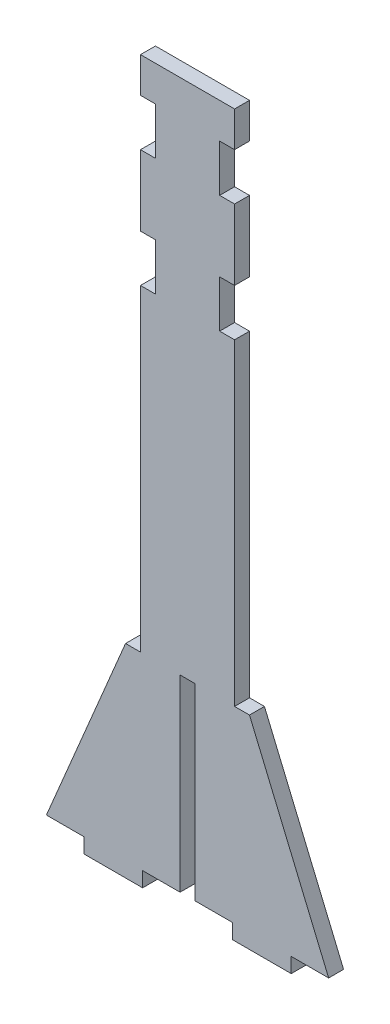
ISO-10303-21;
HEADER;
FILE_DESCRIPTION(('STEP AP214'),'2;1');
FILE_NAME('part.step','',(''),(''),'','','');
FILE_SCHEMA(('AUTOMOTIVE_DESIGN { 1 0 10303 214 1 1 1 1 }'));
ENDSEC;
DATA;
#1=APPLICATION_CONTEXT('core data for automotive mechanical design processes');
#2=APPLICATION_PROTOCOL_DEFINITION('international standard','automotive_design',2000,#1);
#3=PRODUCT_CONTEXT('',#1,'mechanical');
#4=PRODUCT('Part','Part','',(#3));
#5=PRODUCT_RELATED_PRODUCT_CATEGORY('part','',(#4));
#6=PRODUCT_DEFINITION_FORMATION('','',#4);
#7=PRODUCT_DEFINITION_CONTEXT('part definition',#1,'design');
#8=PRODUCT_DEFINITION('design','',#6,#7);
#9=PRODUCT_DEFINITION_SHAPE('','',#8);
#10=(LENGTH_UNIT() NAMED_UNIT(*) SI_UNIT(.MILLI.,.METRE.));
#11=(NAMED_UNIT(*) PLANE_ANGLE_UNIT() SI_UNIT($,.RADIAN.));
#12=(NAMED_UNIT(*) SI_UNIT($,.STERADIAN.) SOLID_ANGLE_UNIT());
#13=UNCERTAINTY_MEASURE_WITH_UNIT(LENGTH_MEASURE(1.E-05),#10,'distance_accuracy_value','');
#14=(GEOMETRIC_REPRESENTATION_CONTEXT(3) GLOBAL_UNCERTAINTY_ASSIGNED_CONTEXT((#13)) GLOBAL_UNIT_ASSIGNED_CONTEXT((#10,
#11,#12)) REPRESENTATION_CONTEXT('',''));
#15=CARTESIAN_POINT('',(0.,0.,0.));
#16=DIRECTION('',(0.,0.,1.));
#17=DIRECTION('',(1.,0.,0.));
#18=AXIS2_PLACEMENT_3D('',#15,#16,#17);
#19=CARTESIAN_POINT('',(-60.,0.,6.35));
#20=DIRECTION('',(0.,1.,0.));
#21=DIRECTION('',(-1.,0.,0.));
#22=AXIS2_PLACEMENT_3D('',#19,#20,#21);
#23=PLANE('',#22);
#24=DIRECTION('',(0.,0.,-1.));
#25=VECTOR('',#24,1.);
#26=CARTESIAN_POINT('',(19.0875,0.,6.35));
#27=LINE('',#26,#25);
#28=CARTESIAN_POINT('',(19.0875,0.,6.35));
#29=VERTEX_POINT('',#28);
#30=CARTESIAN_POINT('',(19.0875,0.,0.));
#31=VERTEX_POINT('',#30);
#32=EDGE_CURVE('E60',#29,#31,#27,.T.);
#33=ORIENTED_EDGE('',*,*,#32,.F.);
#34=DIRECTION('',(1.,0.,0.));
#35=VECTOR('',#34,1.);
#36=CARTESIAN_POINT('',(-60.,0.,6.35));
#37=LINE('',#36,#35);
#38=CARTESIAN_POINT('',(3.17500000000005,0.,6.35));
#39=VERTEX_POINT('',#38);
#40=EDGE_CURVE('E296',#39,#29,#37,.T.);
#41=ORIENTED_EDGE('',*,*,#40,.F.);
#42=DIRECTION('',(0.,0.,1.));
#43=VECTOR('',#42,1.);
#44=CARTESIAN_POINT('',(3.17500000000005,0.,-0.00100000000000013));
#45=LINE('',#44,#43);
#46=CARTESIAN_POINT('',(3.17500000000005,0.,0.));
#47=VERTEX_POINT('',#46);
#48=EDGE_CURVE('E457',#47,#39,#45,.T.);
#49=ORIENTED_EDGE('',*,*,#48,.F.);
#50=DIRECTION('',(1.,0.,0.));
#51=VECTOR('',#50,1.);
#52=CARTESIAN_POINT('',(-60.,0.,0.));
#53=LINE('',#52,#51);
#54=EDGE_CURVE('E499',#47,#31,#53,.T.);
#55=ORIENTED_EDGE('',*,*,#54,.T.);
#56=EDGE_LOOP('',(#33,#41,#49,#55));
#57=FACE_BOUND('',#56,.T.);
#58=ADVANCED_FACE('F37',(#57),#23,.F.);
#59=DIRECTION('',(0.,0.,1.));
#60=VECTOR('',#59,1.);
#61=CARTESIAN_POINT('',(44.0875,0.,6.34999999999999));
#62=LINE('',#61,#60);
#63=CARTESIAN_POINT('',(44.0875,0.,0.));
#64=VERTEX_POINT('',#63);
#65=CARTESIAN_POINT('',(44.0875,0.,6.35));
#66=VERTEX_POINT('',#65);
#67=EDGE_CURVE('E291',#64,#66,#62,.T.);
#68=ORIENTED_EDGE('',*,*,#67,.F.);
#69=CARTESIAN_POINT('',(60.,0.,0.));
#70=VERTEX_POINT('',#69);
#71=EDGE_CURVE('E494',#64,#70,#53,.T.);
#72=ORIENTED_EDGE('',*,*,#71,.T.);
#73=DIRECTION('',(0.,0.,-1.));
#74=VECTOR('',#73,1.);
#75=CARTESIAN_POINT('',(60.,0.,6.35));
#76=LINE('',#75,#74);
#77=CARTESIAN_POINT('',(60.,0.,6.35));
#78=VERTEX_POINT('',#77);
#79=EDGE_CURVE('E521',#78,#70,#76,.T.);
#80=ORIENTED_EDGE('',*,*,#79,.F.);
#81=EDGE_CURVE('E52',#66,#78,#37,.T.);
#82=ORIENTED_EDGE('',*,*,#81,.F.);
#83=EDGE_LOOP('',(#68,#72,#80,#82));
#84=FACE_BOUND('',#83,.T.);
#85=ADVANCED_FACE('F625',(#84),#23,.F.);
#86=DIRECTION('',(0.,0.,1.));
#87=VECTOR('',#86,1.);
#88=CARTESIAN_POINT('',(-19.0875,0.,6.35));
#89=LINE('',#88,#87);
#90=CARTESIAN_POINT('',(-19.0875,0.,0.));
#91=VERTEX_POINT('',#90);
#92=CARTESIAN_POINT('',(-19.0875,0.,6.35));
#93=VERTEX_POINT('',#92);
#94=EDGE_CURVE('E297',#91,#93,#89,.T.);
#95=ORIENTED_EDGE('',*,*,#94,.F.);
#96=CARTESIAN_POINT('',(-3.17499999999996,0.,0.));
#97=VERTEX_POINT('',#96);
#98=EDGE_CURVE('E498',#91,#97,#53,.T.);
#99=ORIENTED_EDGE('',*,*,#98,.T.);
#100=DIRECTION('',(0.,0.,1.));
#101=VECTOR('',#100,1.);
#102=CARTESIAN_POINT('',(-3.17499999999995,0.,-0.00100000000000013));
#103=LINE('',#102,#101);
#104=CARTESIAN_POINT('',(-3.17499999999995,0.,6.35));
#105=VERTEX_POINT('',#104);
#106=EDGE_CURVE('E451',#97,#105,#103,.T.);
#107=ORIENTED_EDGE('',*,*,#106,.T.);
#108=EDGE_CURVE('E474',#93,#105,#37,.T.);
#109=ORIENTED_EDGE('',*,*,#108,.F.);
#110=EDGE_LOOP('',(#95,#99,#107,#109));
#111=FACE_BOUND('',#110,.T.);
#112=ADVANCED_FACE('F631',(#111),#23,.F.);
#113=DIRECTION('',(0.,0.,-1.));
#114=VECTOR('',#113,1.);
#115=CARTESIAN_POINT('',(-44.0875,0.,6.34999999999999));
#116=LINE('',#115,#114);
#117=CARTESIAN_POINT('',(-44.0875,0.,6.35));
#118=VERTEX_POINT('',#117);
#119=CARTESIAN_POINT('',(-44.0875,0.,0.));
#120=VERTEX_POINT('',#119);
#121=EDGE_CURVE('E300',#118,#120,#116,.T.);
#122=ORIENTED_EDGE('',*,*,#121,.F.);
#123=CARTESIAN_POINT('',(-60.,0.,6.35));
#124=VERTEX_POINT('',#123);
#125=EDGE_CURVE('E470',#124,#118,#37,.T.);
#126=ORIENTED_EDGE('',*,*,#125,.F.);
#127=DIRECTION('',(0.,0.,-1.));
#128=VECTOR('',#127,1.);
#129=CARTESIAN_POINT('',(-60.,0.,6.35));
#130=LINE('',#129,#128);
#131=CARTESIAN_POINT('',(-60.,0.,0.));
#132=VERTEX_POINT('',#131);
#133=EDGE_CURVE('E524',#124,#132,#130,.T.);
#134=ORIENTED_EDGE('',*,*,#133,.T.);
#135=EDGE_CURVE('E495',#132,#120,#53,.T.);
#136=ORIENTED_EDGE('',*,*,#135,.T.);
#137=EDGE_LOOP('',(#122,#126,#134,#136));
#138=FACE_BOUND('',#137,.T.);
#139=ADVANCED_FACE('F543',(#138),#23,.F.);
#140=CARTESIAN_POINT('',(-20.,300.,6.35));
#141=DIRECTION('',(1.,0.,0.));
#142=DIRECTION('',(0.,1.,0.));
#143=AXIS2_PLACEMENT_3D('',#140,#141,#142);
#144=PLANE('',#143);
#145=DIRECTION('',(0.,-1.,0.));
#146=VECTOR('',#145,1.);
#147=CARTESIAN_POINT('',(-20.,300.,0.));
#148=LINE('',#147,#146);
#149=CARTESIAN_POINT('',(-20.,300.,0.));
#150=VERTEX_POINT('',#149);
#151=CARTESIAN_POINT('',(-20.,285.,0.));
#152=VERTEX_POINT('',#151);
#153=EDGE_CURVE('E486',#150,#152,#148,.T.);
#154=ORIENTED_EDGE('',*,*,#153,.T.);
#155=DIRECTION('',(0.,0.,1.));
#156=VECTOR('',#155,1.);
#157=CARTESIAN_POINT('',(-20.,285.,-0.00100000000000013));
#158=LINE('',#157,#156);
#159=CARTESIAN_POINT('',(-20.,285.,6.35));
#160=VERTEX_POINT('',#159);
#161=EDGE_CURVE('E374',#152,#160,#158,.T.);
#162=ORIENTED_EDGE('',*,*,#161,.T.);
#163=DIRECTION('',(0.,-1.,0.));
#164=VECTOR('',#163,1.);
#165=CARTESIAN_POINT('',(-20.,300.,6.35));
#166=LINE('',#165,#164);
#167=CARTESIAN_POINT('',(-20.,300.,6.35));
#168=VERTEX_POINT('',#167);
#169=EDGE_CURVE('E461',#168,#160,#166,.T.);
#170=ORIENTED_EDGE('',*,*,#169,.F.);
#171=DIRECTION('',(0.,0.,-1.));
#172=VECTOR('',#171,1.);
#173=CARTESIAN_POINT('',(-20.,300.,6.35));
#174=LINE('',#173,#172);
#175=EDGE_CURVE('E485',#168,#150,#174,.T.);
#176=ORIENTED_EDGE('',*,*,#175,.T.);
#177=EDGE_LOOP('',(#154,#162,#170,#176));
#178=FACE_BOUND('',#177,.T.);
#179=ADVANCED_FACE('F583',(#178),#144,.F.);
#180=CARTESIAN_POINT('',(-20.,265.,6.35));
#181=VERTEX_POINT('',#180);
#182=CARTESIAN_POINT('',(-20.,235.,6.35));
#183=VERTEX_POINT('',#182);
#184=EDGE_CURVE('E465',#181,#183,#166,.T.);
#185=ORIENTED_EDGE('',*,*,#184,.F.);
#186=DIRECTION('',(0.,0.,1.));
#187=VECTOR('',#186,1.);
#188=CARTESIAN_POINT('',(-20.,265.,-0.00100000000000013));
#189=LINE('',#188,#187);
#190=CARTESIAN_POINT('',(-20.,265.,0.));
#191=VERTEX_POINT('',#190);
#192=EDGE_CURVE('E373',#191,#181,#189,.T.);
#193=ORIENTED_EDGE('',*,*,#192,.F.);
#194=CARTESIAN_POINT('',(-20.,235.,0.));
#195=VERTEX_POINT('',#194);
#196=EDGE_CURVE('E490',#191,#195,#148,.T.);
#197=ORIENTED_EDGE('',*,*,#196,.T.);
#198=DIRECTION('',(0.,0.,1.));
#199=VECTOR('',#198,1.);
#200=CARTESIAN_POINT('',(-20.,235.,-0.00100000000000013));
#201=LINE('',#200,#199);
#202=EDGE_CURVE('E346',#195,#183,#201,.T.);
#203=ORIENTED_EDGE('',*,*,#202,.T.);
#204=EDGE_LOOP('',(#185,#193,#197,#203));
#205=FACE_BOUND('',#204,.T.);
#206=ADVANCED_FACE('F560',(#205),#144,.F.);
#207=CARTESIAN_POINT('',(20.,300.,6.35));
#208=DIRECTION('',(-1.,0.,0.));
#209=DIRECTION('',(0.,-1.,0.));
#210=AXIS2_PLACEMENT_3D('',#207,#208,#209);
#211=PLANE('',#210);
#212=DIRECTION('',(0.,1.,0.));
#213=VECTOR('',#212,1.);
#214=CARTESIAN_POINT('',(20.,300.,6.35));
#215=LINE('',#214,#213);
#216=CARTESIAN_POINT('',(20.,285.,6.35));
#217=VERTEX_POINT('',#216);
#218=CARTESIAN_POINT('',(20.,300.,6.35));
#219=VERTEX_POINT('',#218);
#220=EDGE_CURVE('E478',#217,#219,#215,.T.);
#221=ORIENTED_EDGE('',*,*,#220,.F.);
#222=DIRECTION('',(0.,0.,1.));
#223=VECTOR('',#222,1.);
#224=CARTESIAN_POINT('',(20.,285.,-0.00100000000000013));
#225=LINE('',#224,#223);
#226=CARTESIAN_POINT('',(20.,285.,0.));
#227=VERTEX_POINT('',#226);
#228=EDGE_CURVE('E400',#227,#217,#225,.T.);
#229=ORIENTED_EDGE('',*,*,#228,.F.);
#230=DIRECTION('',(0.,1.,0.));
#231=VECTOR('',#230,1.);
#232=CARTESIAN_POINT('',(20.,300.,0.));
#233=LINE('',#232,#231);
#234=CARTESIAN_POINT('',(20.,300.,0.));
#235=VERTEX_POINT('',#234);
#236=EDGE_CURVE('E503',#227,#235,#233,.T.);
#237=ORIENTED_EDGE('',*,*,#236,.T.);
#238=DIRECTION('',(0.,0.,-1.));
#239=VECTOR('',#238,1.);
#240=CARTESIAN_POINT('',(20.,300.,6.35));
#241=LINE('',#240,#239);
#242=EDGE_CURVE('E512',#219,#235,#241,.T.);
#243=ORIENTED_EDGE('',*,*,#242,.F.);
#244=EDGE_LOOP('',(#221,#229,#237,#243));
#245=FACE_BOUND('',#244,.T.);
#246=ADVANCED_FACE('F611',(#245),#211,.F.);
#247=CARTESIAN_POINT('',(20.,235.,0.));
#248=VERTEX_POINT('',#247);
#249=CARTESIAN_POINT('',(20.,265.,0.));
#250=VERTEX_POINT('',#249);
#251=EDGE_CURVE('E508',#248,#250,#233,.T.);
#252=ORIENTED_EDGE('',*,*,#251,.T.);
#253=DIRECTION('',(0.,0.,1.));
#254=VECTOR('',#253,1.);
#255=CARTESIAN_POINT('',(20.,265.,-0.00100000000000013));
#256=LINE('',#255,#254);
#257=CARTESIAN_POINT('',(20.,265.,6.35));
#258=VERTEX_POINT('',#257);
#259=EDGE_CURVE('E402',#250,#258,#256,.T.);
#260=ORIENTED_EDGE('',*,*,#259,.T.);
#261=CARTESIAN_POINT('',(20.,235.,6.35));
#262=VERTEX_POINT('',#261);
#263=EDGE_CURVE('E483',#262,#258,#215,.T.);
#264=ORIENTED_EDGE('',*,*,#263,.F.);
#265=DIRECTION('',(0.,0.,1.));
#266=VECTOR('',#265,1.);
#267=CARTESIAN_POINT('',(20.,235.,-0.00100000000000013));
#268=LINE('',#267,#266);
#269=EDGE_CURVE('E425',#248,#262,#268,.T.);
#270=ORIENTED_EDGE('',*,*,#269,.F.);
#271=EDGE_LOOP('',(#252,#260,#264,#270));
#272=FACE_BOUND('',#271,.T.);
#273=ADVANCED_FACE('F597',(#272),#211,.F.);
#274=CARTESIAN_POINT('',(-20.,215.,6.35));
#275=VERTEX_POINT('',#274);
#276=CARTESIAN_POINT('',(-20.,80.,6.35));
#277=VERTEX_POINT('',#276);
#278=EDGE_CURVE('E466',#275,#277,#166,.T.);
#279=ORIENTED_EDGE('',*,*,#278,.F.);
#280=DIRECTION('',(0.,0.,1.));
#281=VECTOR('',#280,1.);
#282=CARTESIAN_POINT('',(-20.,215.,-0.00100000000000013));
#283=LINE('',#282,#281);
#284=CARTESIAN_POINT('',(-20.,215.,0.));
#285=VERTEX_POINT('',#284);
#286=EDGE_CURVE('E345',#285,#275,#283,.T.);
#287=ORIENTED_EDGE('',*,*,#286,.F.);
#288=CARTESIAN_POINT('',(-20.,80.,0.));
#289=VERTEX_POINT('',#288);
#290=EDGE_CURVE('E454',#285,#289,#148,.T.);
#291=ORIENTED_EDGE('',*,*,#290,.T.);
#292=DIRECTION('',(0.,0.,-1.));
#293=VECTOR('',#292,1.);
#294=CARTESIAN_POINT('',(-20.,80.,6.35));
#295=LINE('',#294,#293);
#296=EDGE_CURVE('E11',#277,#289,#295,.T.);
#297=ORIENTED_EDGE('',*,*,#296,.F.);
#298=EDGE_LOOP('',(#279,#287,#291,#297));
#299=FACE_BOUND('',#298,.T.);
#300=ADVANCED_FACE('F39',(#299),#144,.F.);
#301=CARTESIAN_POINT('',(-20.,80.,6.35));
#302=DIRECTION('',(0.,-1.,0.));
#303=DIRECTION('',(1.,0.,0.));
#304=AXIS2_PLACEMENT_3D('',#301,#302,#303);
#305=PLANE('',#304);
#306=DIRECTION('',(-1.,0.,0.));
#307=VECTOR('',#306,1.);
#308=CARTESIAN_POINT('',(-20.,80.,0.));
#309=LINE('',#308,#307);
#310=CARTESIAN_POINT('',(-26.35,80.,0.));
#311=VERTEX_POINT('',#310);
#312=EDGE_CURVE('E489',#289,#311,#309,.T.);
#313=ORIENTED_EDGE('',*,*,#312,.T.);
#314=DIRECTION('',(0.,0.,-1.));
#315=VECTOR('',#314,1.);
#316=CARTESIAN_POINT('',(-26.35,80.,6.35));
#317=LINE('',#316,#315);
#318=CARTESIAN_POINT('',(-26.35,80.,6.35));
#319=VERTEX_POINT('',#318);
#320=EDGE_CURVE('E45',#319,#311,#317,.T.);
#321=ORIENTED_EDGE('',*,*,#320,.F.);
#322=DIRECTION('',(-1.,0.,0.));
#323=VECTOR('',#322,1.);
#324=CARTESIAN_POINT('',(-20.,80.,6.35));
#325=LINE('',#324,#323);
#326=EDGE_CURVE('E464',#277,#319,#325,.T.);
#327=ORIENTED_EDGE('',*,*,#326,.F.);
#328=ORIENTED_EDGE('',*,*,#296,.T.);
#329=EDGE_LOOP('',(#313,#321,#327,#328));
#330=FACE_BOUND('',#329,.T.);
#331=ADVANCED_FACE('F552',(#330),#305,.F.);
#332=CARTESIAN_POINT('',(-26.35,80.,6.35));
#333=DIRECTION('',(0.921776291869761,-0.387722152767718,0.));
#334=DIRECTION('',(0.387722152767718,0.921776291869761,0.));
#335=AXIS2_PLACEMENT_3D('',#332,#333,#334);
#336=PLANE('',#335);
#337=DIRECTION('',(-0.387722152767718,-0.921776291869761,0.));
#338=VECTOR('',#337,1.);
#339=CARTESIAN_POINT('',(-26.35,80.,0.));
#340=LINE('',#339,#338);
#341=EDGE_CURVE('E492',#311,#132,#340,.T.);
#342=ORIENTED_EDGE('',*,*,#341,.T.);
#343=ORIENTED_EDGE('',*,*,#133,.F.);
#344=DIRECTION('',(-0.387722152767718,-0.921776291869761,0.));
#345=VECTOR('',#344,1.);
#346=CARTESIAN_POINT('',(-26.35,80.,6.35));
#347=LINE('',#346,#345);
#348=EDGE_CURVE('E468',#319,#124,#347,.T.);
#349=ORIENTED_EDGE('',*,*,#348,.F.);
#350=ORIENTED_EDGE('',*,*,#320,.T.);
#351=EDGE_LOOP('',(#342,#343,#349,#350));
#352=FACE_BOUND('',#351,.T.);
#353=ADVANCED_FACE('F531',(#352),#336,.F.);
#354=CARTESIAN_POINT('',(26.3499999999999,80.,6.35));
#355=DIRECTION('',(-0.92177629186976,-0.387722152767719,0.));
#356=DIRECTION('',(0.387722152767719,-0.92177629186976,0.));
#357=AXIS2_PLACEMENT_3D('',#354,#355,#356);
#358=PLANE('',#357);
#359=DIRECTION('',(-0.387722152767719,0.92177629186976,0.));
#360=VECTOR('',#359,1.);
#361=CARTESIAN_POINT('',(26.3499999999999,80.,0.));
#362=LINE('',#361,#360);
#363=CARTESIAN_POINT('',(26.3499999999999,80.,0.));
#364=VERTEX_POINT('',#363);
#365=EDGE_CURVE('E497',#70,#364,#362,.T.);
#366=ORIENTED_EDGE('',*,*,#365,.T.);
#367=DIRECTION('',(0.,0.,-1.));
#368=VECTOR('',#367,1.);
#369=CARTESIAN_POINT('',(26.3499999999999,80.,6.35));
#370=LINE('',#369,#368);
#371=CARTESIAN_POINT('',(26.3499999999999,80.,6.35));
#372=VERTEX_POINT('',#371);
#373=EDGE_CURVE('E518',#372,#364,#370,.T.);
#374=ORIENTED_EDGE('',*,*,#373,.F.);
#375=DIRECTION('',(-0.387722152767719,0.92177629186976,0.));
#376=VECTOR('',#375,1.);
#377=CARTESIAN_POINT('',(26.3499999999999,80.,6.35));
#378=LINE('',#377,#376);
#379=EDGE_CURVE('E473',#78,#372,#378,.T.);
#380=ORIENTED_EDGE('',*,*,#379,.F.);
#381=ORIENTED_EDGE('',*,*,#79,.T.);
#382=EDGE_LOOP('',(#366,#374,#380,#381));
#383=FACE_BOUND('',#382,.T.);
#384=ADVANCED_FACE('F655',(#383),#358,.F.);
#385=CARTESIAN_POINT('',(26.3499999999999,80.,6.35));
#386=DIRECTION('',(0.,-1.,0.));
#387=DIRECTION('',(1.,0.,0.));
#388=AXIS2_PLACEMENT_3D('',#385,#386,#387);
#389=PLANE('',#388);
#390=DIRECTION('',(-1.,0.,0.));
#391=VECTOR('',#390,1.);
#392=CARTESIAN_POINT('',(26.3499999999999,80.,0.));
#393=LINE('',#392,#391);
#394=CARTESIAN_POINT('',(19.9999999999999,80.,0.));
#395=VERTEX_POINT('',#394);
#396=EDGE_CURVE('E501',#364,#395,#393,.T.);
#397=ORIENTED_EDGE('',*,*,#396,.T.);
#398=DIRECTION('',(0.,0.,-1.));
#399=VECTOR('',#398,1.);
#400=CARTESIAN_POINT('',(19.9999999999999,80.,6.35));
#401=LINE('',#400,#399);
#402=CARTESIAN_POINT('',(19.9999999999999,80.,6.35));
#403=VERTEX_POINT('',#402);
#404=EDGE_CURVE('E515',#403,#395,#401,.T.);
#405=ORIENTED_EDGE('',*,*,#404,.F.);
#406=DIRECTION('',(-1.,0.,0.));
#407=VECTOR('',#406,1.);
#408=CARTESIAN_POINT('',(26.3499999999999,80.,6.35));
#409=LINE('',#408,#407);
#410=EDGE_CURVE('E476',#372,#403,#409,.T.);
#411=ORIENTED_EDGE('',*,*,#410,.F.);
#412=ORIENTED_EDGE('',*,*,#373,.T.);
#413=EDGE_LOOP('',(#397,#405,#411,#412));
#414=FACE_BOUND('',#413,.T.);
#415=ADVANCED_FACE('F622',(#414),#389,.F.);
#416=CARTESIAN_POINT('',(20.,215.,0.));
#417=VERTEX_POINT('',#416);
#418=EDGE_CURVE('E504',#395,#417,#233,.T.);
#419=ORIENTED_EDGE('',*,*,#418,.T.);
#420=DIRECTION('',(0.,0.,1.));
#421=VECTOR('',#420,1.);
#422=CARTESIAN_POINT('',(20.,215.,-0.00100000000000013));
#423=LINE('',#422,#421);
#424=CARTESIAN_POINT('',(20.,215.,6.35));
#425=VERTEX_POINT('',#424);
#426=EDGE_CURVE('E427',#417,#425,#423,.T.);
#427=ORIENTED_EDGE('',*,*,#426,.T.);
#428=EDGE_CURVE('E479',#403,#425,#215,.T.);
#429=ORIENTED_EDGE('',*,*,#428,.F.);
#430=ORIENTED_EDGE('',*,*,#404,.T.);
#431=EDGE_LOOP('',(#419,#427,#429,#430));
#432=FACE_BOUND('',#431,.T.);
#433=ADVANCED_FACE('F614',(#432),#211,.F.);
#434=CARTESIAN_POINT('',(-20.,300.,6.35));
#435=DIRECTION('',(0.,-1.,0.));
#436=DIRECTION('',(0.,0.,-1.));
#437=AXIS2_PLACEMENT_3D('',#434,#435,#436);
#438=PLANE('',#437);
#439=DIRECTION('',(-1.,0.,0.));
#440=VECTOR('',#439,1.);
#441=CARTESIAN_POINT('',(-20.,300.,0.));
#442=LINE('',#441,#440);
#443=EDGE_CURVE('E507',#235,#150,#442,.T.);
#444=ORIENTED_EDGE('',*,*,#443,.T.);
#445=ORIENTED_EDGE('',*,*,#175,.F.);
#446=DIRECTION('',(-1.,0.,0.));
#447=VECTOR('',#446,1.);
#448=CARTESIAN_POINT('',(-20.,300.,6.35));
#449=LINE('',#448,#447);
#450=EDGE_CURVE('E482',#219,#168,#449,.T.);
#451=ORIENTED_EDGE('',*,*,#450,.F.);
#452=ORIENTED_EDGE('',*,*,#242,.T.);
#453=EDGE_LOOP('',(#444,#445,#451,#452));
#454=FACE_BOUND('',#453,.T.);
#455=ADVANCED_FACE('F588',(#454),#438,.F.);
#456=CARTESIAN_POINT('',(0.,0.,6.35));
#457=DIRECTION('',(0.,0.,-1.));
#458=DIRECTION('',(-1.,0.,0.));
#459=AXIS2_PLACEMENT_3D('',#456,#457,#458);
#460=PLANE('',#459);
#461=DIRECTION('',(0.,-1.,0.));
#462=VECTOR('',#461,1.);
#463=CARTESIAN_POINT('',(13.65,265.,6.35));
#464=LINE('',#463,#462);
#465=CARTESIAN_POINT('',(13.65,285.,6.35));
#466=VERTEX_POINT('',#465);
#467=CARTESIAN_POINT('',(13.65,265.,6.35));
#468=VERTEX_POINT('',#467);
#469=EDGE_CURVE('E389',#466,#468,#464,.T.);
#470=ORIENTED_EDGE('',*,*,#469,.F.);
#471=DIRECTION('',(-1.,0.,0.));
#472=VECTOR('',#471,1.);
#473=CARTESIAN_POINT('',(13.65,285.,6.35));
#474=LINE('',#473,#472);
#475=EDGE_CURVE('E394',#217,#466,#474,.T.);
#476=ORIENTED_EDGE('',*,*,#475,.F.);
#477=ORIENTED_EDGE('',*,*,#220,.T.);
#478=ORIENTED_EDGE('',*,*,#450,.T.);
#479=ORIENTED_EDGE('',*,*,#169,.T.);
#480=DIRECTION('',(-1.,0.,0.));
#481=VECTOR('',#480,1.);
#482=CARTESIAN_POINT('',(-20.,285.,6.35));
#483=LINE('',#482,#481);
#484=CARTESIAN_POINT('',(-13.65,285.,6.35));
#485=VERTEX_POINT('',#484);
#486=EDGE_CURVE('E371',#485,#160,#483,.T.);
#487=ORIENTED_EDGE('',*,*,#486,.F.);
#488=DIRECTION('',(0.,1.,0.));
#489=VECTOR('',#488,1.);
#490=CARTESIAN_POINT('',(-13.65,265.,6.35));
#491=LINE('',#490,#489);
#492=CARTESIAN_POINT('',(-13.65,265.,6.35));
#493=VERTEX_POINT('',#492);
#494=EDGE_CURVE('E368',#493,#485,#491,.T.);
#495=ORIENTED_EDGE('',*,*,#494,.F.);
#496=DIRECTION('',(1.,0.,0.));
#497=VECTOR('',#496,1.);
#498=CARTESIAN_POINT('',(-20.,265.,6.35));
#499=LINE('',#498,#497);
#500=EDGE_CURVE('E365',#181,#493,#499,.T.);
#501=ORIENTED_EDGE('',*,*,#500,.F.);
#502=ORIENTED_EDGE('',*,*,#184,.T.);
#503=DIRECTION('',(-1.,0.,0.));
#504=VECTOR('',#503,1.);
#505=CARTESIAN_POINT('',(-20.,235.,6.35));
#506=LINE('',#505,#504);
#507=CARTESIAN_POINT('',(-13.65,235.,6.35));
#508=VERTEX_POINT('',#507);
#509=EDGE_CURVE('E343',#508,#183,#506,.T.);
#510=ORIENTED_EDGE('',*,*,#509,.F.);
#511=DIRECTION('',(0.,1.,0.));
#512=VECTOR('',#511,1.);
#513=CARTESIAN_POINT('',(-13.65,215.,6.35));
#514=LINE('',#513,#512);
#515=CARTESIAN_POINT('',(-13.65,215.,6.35));
#516=VERTEX_POINT('',#515);
#517=EDGE_CURVE('E340',#516,#508,#514,.T.);
#518=ORIENTED_EDGE('',*,*,#517,.F.);
#519=DIRECTION('',(1.,0.,0.));
#520=VECTOR('',#519,1.);
#521=CARTESIAN_POINT('',(-20.,215.,6.35));
#522=LINE('',#521,#520);
#523=EDGE_CURVE('E337',#275,#516,#522,.T.);
#524=ORIENTED_EDGE('',*,*,#523,.F.);
#525=ORIENTED_EDGE('',*,*,#278,.T.);
#526=ORIENTED_EDGE('',*,*,#326,.T.);
#527=ORIENTED_EDGE('',*,*,#348,.T.);
#528=ORIENTED_EDGE('',*,*,#125,.T.);
#529=DIRECTION('',(0.,1.,0.));
#530=VECTOR('',#529,1.);
#531=CARTESIAN_POINT('',(-44.0875,-6.35000000000001,6.34999999999999));
#532=LINE('',#531,#530);
#533=CARTESIAN_POINT('',(-44.0875,-6.35000000000001,6.34999999999999));
#534=VERTEX_POINT('',#533);
#535=EDGE_CURVE('E323',#534,#118,#532,.T.);
#536=ORIENTED_EDGE('',*,*,#535,.F.);
#537=DIRECTION('',(-1.,0.,0.));
#538=VECTOR('',#537,1.);
#539=CARTESIAN_POINT('',(-19.0875,-6.35,6.35));
#540=LINE('',#539,#538);
#541=CARTESIAN_POINT('',(-19.0875,-6.35,6.35));
#542=VERTEX_POINT('',#541);
#543=EDGE_CURVE('E309',#542,#534,#540,.T.);
#544=ORIENTED_EDGE('',*,*,#543,.F.);
#545=DIRECTION('',(0.,1.,0.));
#546=VECTOR('',#545,1.);
#547=CARTESIAN_POINT('',(-19.0875,-6.35,6.35));
#548=LINE('',#547,#546);
#549=EDGE_CURVE('E326',#542,#93,#548,.T.);
#550=ORIENTED_EDGE('',*,*,#549,.T.);
#551=ORIENTED_EDGE('',*,*,#108,.T.);
#552=DIRECTION('',(0.,-1.,0.));
#553=VECTOR('',#552,1.);
#554=CARTESIAN_POINT('',(-3.17499999999996,79.9999999999998,6.35));
#555=LINE('',#554,#553);
#556=CARTESIAN_POINT('',(-3.17499999999996,79.9999999999998,6.35));
#557=VERTEX_POINT('',#556);
#558=EDGE_CURVE('E442',#557,#105,#555,.T.);
#559=ORIENTED_EDGE('',*,*,#558,.F.);
#560=DIRECTION('',(-1.,0.,0.));
#561=VECTOR('',#560,1.);
#562=CARTESIAN_POINT('',(-3.17499999999996,79.9999999999998,6.35));
#563=LINE('',#562,#561);
#564=CARTESIAN_POINT('',(3.17500000000004,79.9999999999998,6.35));
#565=VERTEX_POINT('',#564);
#566=EDGE_CURVE('E448',#565,#557,#563,.T.);
#567=ORIENTED_EDGE('',*,*,#566,.F.);
#568=DIRECTION('',(0.,1.,0.));
#569=VECTOR('',#568,1.);
#570=CARTESIAN_POINT('',(3.17500000000004,79.9999999999998,6.35));
#571=LINE('',#570,#569);
#572=EDGE_CURVE('E445',#39,#565,#571,.T.);
#573=ORIENTED_EDGE('',*,*,#572,.F.);
#574=ORIENTED_EDGE('',*,*,#40,.T.);
#575=DIRECTION('',(0.,1.,0.));
#576=VECTOR('',#575,1.);
#577=CARTESIAN_POINT('',(19.0875,-6.35,6.35));
#578=LINE('',#577,#576);
#579=CARTESIAN_POINT('',(19.0875,-6.35,6.35));
#580=VERTEX_POINT('',#579);
#581=EDGE_CURVE('E276',#580,#29,#578,.T.);
#582=ORIENTED_EDGE('',*,*,#581,.F.);
#583=DIRECTION('',(-1.,0.,0.));
#584=VECTOR('',#583,1.);
#585=CARTESIAN_POINT('',(19.0875,-6.35,6.35));
#586=LINE('',#585,#584);
#587=CARTESIAN_POINT('',(44.0875,-6.34999999999999,6.34999999999999));
#588=VERTEX_POINT('',#587);
#589=EDGE_CURVE('E282',#588,#580,#586,.T.);
#590=ORIENTED_EDGE('',*,*,#589,.F.);
#591=DIRECTION('',(0.,1.,0.));
#592=VECTOR('',#591,1.);
#593=CARTESIAN_POINT('',(44.0875,-6.34999999999999,6.34999999999999));
#594=LINE('',#593,#592);
#595=EDGE_CURVE('E664',#588,#66,#594,.T.);
#596=ORIENTED_EDGE('',*,*,#595,.T.);
#597=ORIENTED_EDGE('',*,*,#81,.T.);
#598=ORIENTED_EDGE('',*,*,#379,.T.);
#599=ORIENTED_EDGE('',*,*,#410,.T.);
#600=ORIENTED_EDGE('',*,*,#428,.T.);
#601=DIRECTION('',(1.,0.,0.));
#602=VECTOR('',#601,1.);
#603=CARTESIAN_POINT('',(13.65,215.,6.35));
#604=LINE('',#603,#602);
#605=CARTESIAN_POINT('',(13.65,215.,6.35));
#606=VERTEX_POINT('',#605);
#607=EDGE_CURVE('E416',#606,#425,#604,.T.);
#608=ORIENTED_EDGE('',*,*,#607,.F.);
#609=DIRECTION('',(0.,-1.,0.));
#610=VECTOR('',#609,1.);
#611=CARTESIAN_POINT('',(13.65,215.,6.35));
#612=LINE('',#611,#610);
#613=CARTESIAN_POINT('',(13.65,235.,6.35));
#614=VERTEX_POINT('',#613);
#615=EDGE_CURVE('E413',#614,#606,#612,.T.);
#616=ORIENTED_EDGE('',*,*,#615,.F.);
#617=DIRECTION('',(-1.,0.,0.));
#618=VECTOR('',#617,1.);
#619=CARTESIAN_POINT('',(13.65,235.,6.35));
#620=LINE('',#619,#618);
#621=EDGE_CURVE('E418',#262,#614,#620,.T.);
#622=ORIENTED_EDGE('',*,*,#621,.F.);
#623=ORIENTED_EDGE('',*,*,#263,.T.);
#624=DIRECTION('',(1.,0.,0.));
#625=VECTOR('',#624,1.);
#626=CARTESIAN_POINT('',(13.65,265.,6.35));
#627=LINE('',#626,#625);
#628=EDGE_CURVE('E392',#468,#258,#627,.T.);
#629=ORIENTED_EDGE('',*,*,#628,.F.);
#630=EDGE_LOOP('',(#470,#476,#477,#478,#479,#487,#495,#501,#502,#510,#518,#524,#525,#526,#527,
#528,#536,#544,#550,#551,#559,#567,#573,#574,#582,#590,#596,#597,#598,#599,#600,#608,#616,#622,
#623,#629));
#631=FACE_BOUND('',#630,.T.);
#632=ADVANCED_FACE('F294',(#631),#460,.F.);
#633=CARTESIAN_POINT('',(0.,0.,0.));
#634=DIRECTION('',(0.,0.,-1.));
#635=DIRECTION('',(-1.,0.,0.));
#636=AXIS2_PLACEMENT_3D('',#633,#634,#635);
#637=PLANE('',#636);
#638=DIRECTION('',(-1.,0.,0.));
#639=VECTOR('',#638,1.);
#640=CARTESIAN_POINT('',(13.65,285.,0.));
#641=LINE('',#640,#639);
#642=CARTESIAN_POINT('',(13.65,285.,0.));
#643=VERTEX_POINT('',#642);
#644=EDGE_CURVE('E386',#227,#643,#641,.T.);
#645=ORIENTED_EDGE('',*,*,#644,.T.);
#646=DIRECTION('',(0.,-1.,0.));
#647=VECTOR('',#646,1.);
#648=CARTESIAN_POINT('',(13.65,265.,0.));
#649=LINE('',#648,#647);
#650=CARTESIAN_POINT('',(13.65,265.,0.));
#651=VERTEX_POINT('',#650);
#652=EDGE_CURVE('E329',#643,#651,#649,.T.);
#653=ORIENTED_EDGE('',*,*,#652,.T.);
#654=DIRECTION('',(1.,0.,0.));
#655=VECTOR('',#654,1.);
#656=CARTESIAN_POINT('',(13.65,265.,0.));
#657=LINE('',#656,#655);
#658=EDGE_CURVE('E362',#651,#250,#657,.T.);
#659=ORIENTED_EDGE('',*,*,#658,.T.);
#660=ORIENTED_EDGE('',*,*,#251,.F.);
#661=DIRECTION('',(-1.,0.,0.));
#662=VECTOR('',#661,1.);
#663=CARTESIAN_POINT('',(13.65,235.,0.));
#664=LINE('',#663,#662);
#665=CARTESIAN_POINT('',(13.65,235.,0.));
#666=VERTEX_POINT('',#665);
#667=EDGE_CURVE('E410',#248,#666,#664,.T.);
#668=ORIENTED_EDGE('',*,*,#667,.T.);
#669=DIRECTION('',(0.,-1.,0.));
#670=VECTOR('',#669,1.);
#671=CARTESIAN_POINT('',(13.65,215.,0.));
#672=LINE('',#671,#670);
#673=CARTESIAN_POINT('',(13.65,215.,0.));
#674=VERTEX_POINT('',#673);
#675=EDGE_CURVE('E357',#666,#674,#672,.T.);
#676=ORIENTED_EDGE('',*,*,#675,.T.);
#677=DIRECTION('',(1.,0.,0.));
#678=VECTOR('',#677,1.);
#679=CARTESIAN_POINT('',(13.65,215.,0.));
#680=LINE('',#679,#678);
#681=EDGE_CURVE('E424',#674,#417,#680,.T.);
#682=ORIENTED_EDGE('',*,*,#681,.T.);
#683=ORIENTED_EDGE('',*,*,#418,.F.);
#684=ORIENTED_EDGE('',*,*,#396,.F.);
#685=ORIENTED_EDGE('',*,*,#365,.F.);
#686=ORIENTED_EDGE('',*,*,#71,.F.);
#687=DIRECTION('',(0.,1.,0.));
#688=VECTOR('',#687,1.);
#689=CARTESIAN_POINT('',(44.0875,-6.34999999999999,0.));
#690=LINE('',#689,#688);
#691=CARTESIAN_POINT('',(44.0875,-6.34999999999999,0.));
#692=VERTEX_POINT('',#691);
#693=EDGE_CURVE('E302',#692,#64,#690,.T.);
#694=ORIENTED_EDGE('',*,*,#693,.F.);
#695=DIRECTION('',(1.,0.,0.));
#696=VECTOR('',#695,1.);
#697=CARTESIAN_POINT('',(19.0875,-6.35,0.));
#698=LINE('',#697,#696);
#699=CARTESIAN_POINT('',(19.0875,-6.35,0.));
#700=VERTEX_POINT('',#699);
#701=EDGE_CURVE('E281',#700,#692,#698,.T.);
#702=ORIENTED_EDGE('',*,*,#701,.F.);
#703=DIRECTION('',(0.,1.,0.));
#704=VECTOR('',#703,1.);
#705=CARTESIAN_POINT('',(19.0875,-6.35,0.));
#706=LINE('',#705,#704);
#707=EDGE_CURVE('E278',#700,#31,#706,.T.);
#708=ORIENTED_EDGE('',*,*,#707,.T.);
#709=ORIENTED_EDGE('',*,*,#54,.F.);
#710=DIRECTION('',(0.,1.,0.));
#711=VECTOR('',#710,1.);
#712=CARTESIAN_POINT('',(3.17500000000004,79.9999999999998,0.));
#713=LINE('',#712,#711);
#714=CARTESIAN_POINT('',(3.17500000000004,79.9999999999998,0.));
#715=VERTEX_POINT('',#714);
#716=EDGE_CURVE('E433',#47,#715,#713,.T.);
#717=ORIENTED_EDGE('',*,*,#716,.T.);
#718=DIRECTION('',(-1.,0.,0.));
#719=VECTOR('',#718,1.);
#720=CARTESIAN_POINT('',(-3.17499999999996,79.9999999999998,0.));
#721=LINE('',#720,#719);
#722=CARTESIAN_POINT('',(-3.17499999999996,79.9999999999998,0.));
#723=VERTEX_POINT('',#722);
#724=EDGE_CURVE('E436',#715,#723,#721,.T.);
#725=ORIENTED_EDGE('',*,*,#724,.T.);
#726=DIRECTION('',(0.,-1.,0.));
#727=VECTOR('',#726,1.);
#728=CARTESIAN_POINT('',(-3.17499999999996,79.9999999999998,0.));
#729=LINE('',#728,#727);
#730=EDGE_CURVE('E439',#723,#97,#729,.T.);
#731=ORIENTED_EDGE('',*,*,#730,.T.);
#732=ORIENTED_EDGE('',*,*,#98,.F.);
#733=DIRECTION('',(0.,1.,0.));
#734=VECTOR('',#733,1.);
#735=CARTESIAN_POINT('',(-19.0875,-6.35,0.));
#736=LINE('',#735,#734);
#737=CARTESIAN_POINT('',(-19.0875,-6.35,0.));
#738=VERTEX_POINT('',#737);
#739=EDGE_CURVE('E314',#738,#91,#736,.T.);
#740=ORIENTED_EDGE('',*,*,#739,.F.);
#741=DIRECTION('',(1.,0.,0.));
#742=VECTOR('',#741,1.);
#743=CARTESIAN_POINT('',(-19.0875,-6.35,0.));
#744=LINE('',#743,#742);
#745=CARTESIAN_POINT('',(-44.0875,-6.35000000000001,0.));
#746=VERTEX_POINT('',#745);
#747=EDGE_CURVE('E313',#746,#738,#744,.T.);
#748=ORIENTED_EDGE('',*,*,#747,.F.);
#749=DIRECTION('',(0.,1.,0.));
#750=VECTOR('',#749,1.);
#751=CARTESIAN_POINT('',(-44.0875,-6.35000000000001,0.));
#752=LINE('',#751,#750);
#753=EDGE_CURVE('E320',#746,#120,#752,.T.);
#754=ORIENTED_EDGE('',*,*,#753,.T.);
#755=ORIENTED_EDGE('',*,*,#135,.F.);
#756=ORIENTED_EDGE('',*,*,#341,.F.);
#757=ORIENTED_EDGE('',*,*,#312,.F.);
#758=ORIENTED_EDGE('',*,*,#290,.F.);
#759=DIRECTION('',(1.,0.,0.));
#760=VECTOR('',#759,1.);
#761=CARTESIAN_POINT('',(-20.,215.,0.));
#762=LINE('',#761,#760);
#763=CARTESIAN_POINT('',(-13.65,215.,0.));
#764=VERTEX_POINT('',#763);
#765=EDGE_CURVE('E349',#285,#764,#762,.T.);
#766=ORIENTED_EDGE('',*,*,#765,.T.);
#767=DIRECTION('',(0.,1.,0.));
#768=VECTOR('',#767,1.);
#769=CARTESIAN_POINT('',(-13.65,215.,0.));
#770=LINE('',#769,#768);
#771=CARTESIAN_POINT('',(-13.65,235.,0.));
#772=VERTEX_POINT('',#771);
#773=EDGE_CURVE('E330',#764,#772,#770,.T.);
#774=ORIENTED_EDGE('',*,*,#773,.T.);
#775=DIRECTION('',(-1.,0.,0.));
#776=VECTOR('',#775,1.);
#777=CARTESIAN_POINT('',(-20.,235.,0.));
#778=LINE('',#777,#776);
#779=EDGE_CURVE('E333',#772,#195,#778,.T.);
#780=ORIENTED_EDGE('',*,*,#779,.T.);
#781=ORIENTED_EDGE('',*,*,#196,.F.);
#782=DIRECTION('',(1.,0.,0.));
#783=VECTOR('',#782,1.);
#784=CARTESIAN_POINT('',(-20.,265.,0.));
#785=LINE('',#784,#783);
#786=CARTESIAN_POINT('',(-13.65,265.,0.));
#787=VERTEX_POINT('',#786);
#788=EDGE_CURVE('E334',#191,#787,#785,.T.);
#789=ORIENTED_EDGE('',*,*,#788,.T.);
#790=DIRECTION('',(0.,1.,0.));
#791=VECTOR('',#790,1.);
#792=CARTESIAN_POINT('',(-13.65,265.,0.));
#793=LINE('',#792,#791);
#794=CARTESIAN_POINT('',(-13.65,285.,0.));
#795=VERTEX_POINT('',#794);
#796=EDGE_CURVE('E358',#787,#795,#793,.T.);
#797=ORIENTED_EDGE('',*,*,#796,.T.);
#798=DIRECTION('',(-1.,0.,0.));
#799=VECTOR('',#798,1.);
#800=CARTESIAN_POINT('',(-20.,285.,0.));
#801=LINE('',#800,#799);
#802=EDGE_CURVE('E361',#795,#152,#801,.T.);
#803=ORIENTED_EDGE('',*,*,#802,.T.);
#804=ORIENTED_EDGE('',*,*,#153,.F.);
#805=ORIENTED_EDGE('',*,*,#443,.F.);
#806=ORIENTED_EDGE('',*,*,#236,.F.);
#807=EDGE_LOOP('',(#645,#653,#659,#660,#668,#676,#682,#683,#684,#685,#686,#694,#702,#708,#709,
#717,#725,#731,#732,#740,#748,#754,#755,#756,#757,#758,#766,#774,#780,#781,#789,#797,#803,#804,
#805,#806));
#808=FACE_BOUND('',#807,.T.);
#809=ADVANCED_FACE('F538',(#808),#637,.T.);
#810=CARTESIAN_POINT('',(-3.17499999999996,79.9999999999998,-0.00100000000000013));
#811=DIRECTION('',(-1.,0.,0.));
#812=DIRECTION('',(0.,-1.,0.));
#813=AXIS2_PLACEMENT_3D('',#810,#811,#812);
#814=PLANE('',#813);
#815=DIRECTION('',(0.,0.,1.));
#816=VECTOR('',#815,1.);
#817=CARTESIAN_POINT('',(-3.17499999999996,79.9999999999998,-0.00100000000000013));
#818=LINE('',#817,#816);
#819=EDGE_CURVE('E452',#723,#557,#818,.T.);
#820=ORIENTED_EDGE('',*,*,#819,.T.);
#821=ORIENTED_EDGE('',*,*,#558,.T.);
#822=ORIENTED_EDGE('',*,*,#106,.F.);
#823=ORIENTED_EDGE('',*,*,#730,.F.);
#824=EDGE_LOOP('',(#820,#821,#822,#823));
#825=FACE_BOUND('',#824,.T.);
#826=ADVANCED_FACE('F668',(#825),#814,.F.);
#827=CARTESIAN_POINT('',(-3.17499999999996,79.9999999999998,-0.00100000000000013));
#828=DIRECTION('',(0.,1.,0.));
#829=DIRECTION('',(0.,0.,1.));
#830=AXIS2_PLACEMENT_3D('',#827,#828,#829);
#831=PLANE('',#830);
#832=DIRECTION('',(0.,0.,1.));
#833=VECTOR('',#832,1.);
#834=CARTESIAN_POINT('',(3.17500000000004,79.9999999999998,-0.00100000000000013));
#835=LINE('',#834,#833);
#836=EDGE_CURVE('E455',#715,#565,#835,.T.);
#837=ORIENTED_EDGE('',*,*,#836,.T.);
#838=ORIENTED_EDGE('',*,*,#566,.T.);
#839=ORIENTED_EDGE('',*,*,#819,.F.);
#840=ORIENTED_EDGE('',*,*,#724,.F.);
#841=EDGE_LOOP('',(#837,#838,#839,#840));
#842=FACE_BOUND('',#841,.T.);
#843=ADVANCED_FACE('F672',(#842),#831,.F.);
#844=CARTESIAN_POINT('',(3.17500000000004,79.9999999999998,-0.00100000000000013));
#845=DIRECTION('',(1.,0.,0.));
#846=DIRECTION('',(0.,1.,0.));
#847=AXIS2_PLACEMENT_3D('',#844,#845,#846);
#848=PLANE('',#847);
#849=ORIENTED_EDGE('',*,*,#48,.T.);
#850=ORIENTED_EDGE('',*,*,#572,.T.);
#851=ORIENTED_EDGE('',*,*,#836,.F.);
#852=ORIENTED_EDGE('',*,*,#716,.F.);
#853=EDGE_LOOP('',(#849,#850,#851,#852));
#854=FACE_BOUND('',#853,.T.);
#855=ADVANCED_FACE('F734',(#854),#848,.F.);
#856=CARTESIAN_POINT('',(13.65,215.,-0.00100000000000013));
#857=DIRECTION('',(-1.,0.,0.));
#858=DIRECTION('',(0.,-1.,0.));
#859=AXIS2_PLACEMENT_3D('',#856,#857,#858);
#860=PLANE('',#859);
#861=DIRECTION('',(0.,0.,1.));
#862=VECTOR('',#861,1.);
#863=CARTESIAN_POINT('',(13.65,235.,-0.00100000000000013));
#864=LINE('',#863,#862);
#865=EDGE_CURVE('E422',#666,#614,#864,.T.);
#866=ORIENTED_EDGE('',*,*,#865,.T.);
#867=ORIENTED_EDGE('',*,*,#615,.T.);
#868=DIRECTION('',(0.,0.,1.));
#869=VECTOR('',#868,1.);
#870=CARTESIAN_POINT('',(13.65,215.,-0.00100000000000013));
#871=LINE('',#870,#869);
#872=EDGE_CURVE('E421',#674,#606,#871,.T.);
#873=ORIENTED_EDGE('',*,*,#872,.F.);
#874=ORIENTED_EDGE('',*,*,#675,.F.);
#875=EDGE_LOOP('',(#866,#867,#873,#874));
#876=FACE_BOUND('',#875,.T.);
#877=ADVANCED_FACE('F727',(#876),#860,.F.);
#878=CARTESIAN_POINT('',(13.65,235.,-0.00100000000000013));
#879=DIRECTION('',(0.,1.,0.));
#880=DIRECTION('',(0.,0.,1.));
#881=AXIS2_PLACEMENT_3D('',#878,#879,#880);
#882=PLANE('',#881);
#883=ORIENTED_EDGE('',*,*,#269,.T.);
#884=ORIENTED_EDGE('',*,*,#621,.T.);
#885=ORIENTED_EDGE('',*,*,#865,.F.);
#886=ORIENTED_EDGE('',*,*,#667,.F.);
#887=EDGE_LOOP('',(#883,#884,#885,#886));
#888=FACE_BOUND('',#887,.T.);
#889=ADVANCED_FACE('F724',(#888),#882,.F.);
#890=CARTESIAN_POINT('',(13.65,215.,-0.00100000000000013));
#891=DIRECTION('',(0.,-1.,0.));
#892=DIRECTION('',(0.,0.,-1.));
#893=AXIS2_PLACEMENT_3D('',#890,#891,#892);
#894=PLANE('',#893);
#895=ORIENTED_EDGE('',*,*,#872,.T.);
#896=ORIENTED_EDGE('',*,*,#607,.T.);
#897=ORIENTED_EDGE('',*,*,#426,.F.);
#898=ORIENTED_EDGE('',*,*,#681,.F.);
#899=EDGE_LOOP('',(#895,#896,#897,#898));
#900=FACE_BOUND('',#899,.T.);
#901=ADVANCED_FACE('F702',(#900),#894,.F.);
#902=CARTESIAN_POINT('',(-20.,235.,-0.00100000000000013));
#903=DIRECTION('',(0.,1.,0.));
#904=DIRECTION('',(0.,0.,1.));
#905=AXIS2_PLACEMENT_3D('',#902,#903,#904);
#906=PLANE('',#905);
#907=DIRECTION('',(0.,0.,1.));
#908=VECTOR('',#907,1.);
#909=CARTESIAN_POINT('',(-13.65,235.,-0.00100000000000013));
#910=LINE('',#909,#908);
#911=EDGE_CURVE('E350',#772,#508,#910,.T.);
#912=ORIENTED_EDGE('',*,*,#911,.T.);
#913=ORIENTED_EDGE('',*,*,#509,.T.);
#914=ORIENTED_EDGE('',*,*,#202,.F.);
#915=ORIENTED_EDGE('',*,*,#779,.F.);
#916=EDGE_LOOP('',(#912,#913,#914,#915));
#917=FACE_BOUND('',#916,.T.);
#918=ADVANCED_FACE('F565',(#917),#906,.F.);
#919=CARTESIAN_POINT('',(-13.65,215.,-0.00100000000000013));
#920=DIRECTION('',(1.,0.,0.));
#921=DIRECTION('',(0.,1.,0.));
#922=AXIS2_PLACEMENT_3D('',#919,#920,#921);
#923=PLANE('',#922);
#924=DIRECTION('',(0.,0.,1.));
#925=VECTOR('',#924,1.);
#926=CARTESIAN_POINT('',(-13.65,215.,-0.00100000000000013));
#927=LINE('',#926,#925);
#928=EDGE_CURVE('E352',#764,#516,#927,.T.);
#929=ORIENTED_EDGE('',*,*,#928,.T.);
#930=ORIENTED_EDGE('',*,*,#517,.T.);
#931=ORIENTED_EDGE('',*,*,#911,.F.);
#932=ORIENTED_EDGE('',*,*,#773,.F.);
#933=EDGE_LOOP('',(#929,#930,#931,#932));
#934=FACE_BOUND('',#933,.T.);
#935=ADVANCED_FACE('F567',(#934),#923,.F.);
#936=CARTESIAN_POINT('',(-20.,215.,-0.00100000000000013));
#937=DIRECTION('',(0.,-1.,0.));
#938=DIRECTION('',(0.,0.,-1.));
#939=AXIS2_PLACEMENT_3D('',#936,#937,#938);
#940=PLANE('',#939);
#941=ORIENTED_EDGE('',*,*,#286,.T.);
#942=ORIENTED_EDGE('',*,*,#523,.T.);
#943=ORIENTED_EDGE('',*,*,#928,.F.);
#944=ORIENTED_EDGE('',*,*,#765,.F.);
#945=EDGE_LOOP('',(#941,#942,#943,#944));
#946=FACE_BOUND('',#945,.T.);
#947=ADVANCED_FACE('F705',(#946),#940,.F.);
#948=CARTESIAN_POINT('',(-20.,285.,-0.00100000000000013));
#949=DIRECTION('',(0.,1.,0.));
#950=DIRECTION('',(0.,0.,1.));
#951=AXIS2_PLACEMENT_3D('',#948,#949,#950);
#952=PLANE('',#951);
#953=DIRECTION('',(0.,0.,1.));
#954=VECTOR('',#953,1.);
#955=CARTESIAN_POINT('',(-13.65,285.,-0.00100000000000013));
#956=LINE('',#955,#954);
#957=EDGE_CURVE('E377',#795,#485,#956,.T.);
#958=ORIENTED_EDGE('',*,*,#957,.T.);
#959=ORIENTED_EDGE('',*,*,#486,.T.);
#960=ORIENTED_EDGE('',*,*,#161,.F.);
#961=ORIENTED_EDGE('',*,*,#802,.F.);
#962=EDGE_LOOP('',(#958,#959,#960,#961));
#963=FACE_BOUND('',#962,.T.);
#964=ADVANCED_FACE('F708',(#963),#952,.F.);
#965=CARTESIAN_POINT('',(-13.65,265.,-0.00100000000000013));
#966=DIRECTION('',(1.,0.,0.));
#967=DIRECTION('',(0.,1.,0.));
#968=AXIS2_PLACEMENT_3D('',#965,#966,#967);
#969=PLANE('',#968);
#970=DIRECTION('',(0.,0.,1.));
#971=VECTOR('',#970,1.);
#972=CARTESIAN_POINT('',(-13.65,265.,-0.00100000000000013));
#973=LINE('',#972,#971);
#974=EDGE_CURVE('E379',#787,#493,#973,.T.);
#975=ORIENTED_EDGE('',*,*,#974,.T.);
#976=ORIENTED_EDGE('',*,*,#494,.T.);
#977=ORIENTED_EDGE('',*,*,#957,.F.);
#978=ORIENTED_EDGE('',*,*,#796,.F.);
#979=EDGE_LOOP('',(#975,#976,#977,#978));
#980=FACE_BOUND('',#979,.T.);
#981=ADVANCED_FACE('F578',(#980),#969,.F.);
#982=CARTESIAN_POINT('',(-20.,265.,-0.00100000000000013));
#983=DIRECTION('',(0.,-1.,0.));
#984=DIRECTION('',(0.,0.,-1.));
#985=AXIS2_PLACEMENT_3D('',#982,#983,#984);
#986=PLANE('',#985);
#987=ORIENTED_EDGE('',*,*,#192,.T.);
#988=ORIENTED_EDGE('',*,*,#500,.T.);
#989=ORIENTED_EDGE('',*,*,#974,.F.);
#990=ORIENTED_EDGE('',*,*,#788,.F.);
#991=EDGE_LOOP('',(#987,#988,#989,#990));
#992=FACE_BOUND('',#991,.T.);
#993=ADVANCED_FACE('F574',(#992),#986,.F.);
#994=CARTESIAN_POINT('',(13.65,265.,-0.00100000000000013));
#995=DIRECTION('',(-1.,0.,0.));
#996=DIRECTION('',(0.,-1.,0.));
#997=AXIS2_PLACEMENT_3D('',#994,#995,#996);
#998=PLANE('',#997);
#999=DIRECTION('',(0.,0.,1.));
#1000=VECTOR('',#999,1.);
#1001=CARTESIAN_POINT('',(13.65,285.,-0.00100000000000013));
#1002=LINE('',#1001,#1000);
#1003=EDGE_CURVE('E398',#643,#466,#1002,.T.);
#1004=ORIENTED_EDGE('',*,*,#1003,.T.);
#1005=ORIENTED_EDGE('',*,*,#469,.T.);
#1006=DIRECTION('',(0.,0.,1.));
#1007=VECTOR('',#1006,1.);
#1008=CARTESIAN_POINT('',(13.65,265.,-0.00100000000000013));
#1009=LINE('',#1008,#1007);
#1010=EDGE_CURVE('E397',#651,#468,#1009,.T.);
#1011=ORIENTED_EDGE('',*,*,#1010,.F.);
#1012=ORIENTED_EDGE('',*,*,#652,.F.);
#1013=EDGE_LOOP('',(#1004,#1005,#1011,#1012));
#1014=FACE_BOUND('',#1013,.T.);
#1015=ADVANCED_FACE('F604',(#1014),#998,.F.);
#1016=CARTESIAN_POINT('',(13.65,285.,-0.00100000000000013));
#1017=DIRECTION('',(0.,1.,0.));
#1018=DIRECTION('',(0.,0.,1.));
#1019=AXIS2_PLACEMENT_3D('',#1016,#1017,#1018);
#1020=PLANE('',#1019);
#1021=ORIENTED_EDGE('',*,*,#228,.T.);
#1022=ORIENTED_EDGE('',*,*,#475,.T.);
#1023=ORIENTED_EDGE('',*,*,#1003,.F.);
#1024=ORIENTED_EDGE('',*,*,#644,.F.);
#1025=EDGE_LOOP('',(#1021,#1022,#1023,#1024));
#1026=FACE_BOUND('',#1025,.T.);
#1027=ADVANCED_FACE('F716',(#1026),#1020,.F.);
#1028=CARTESIAN_POINT('',(13.65,265.,-0.00100000000000013));
#1029=DIRECTION('',(0.,-1.,0.));
#1030=DIRECTION('',(0.,0.,-1.));
#1031=AXIS2_PLACEMENT_3D('',#1028,#1029,#1030);
#1032=PLANE('',#1031);
#1033=ORIENTED_EDGE('',*,*,#1010,.T.);
#1034=ORIENTED_EDGE('',*,*,#628,.T.);
#1035=ORIENTED_EDGE('',*,*,#259,.F.);
#1036=ORIENTED_EDGE('',*,*,#658,.F.);
#1037=EDGE_LOOP('',(#1033,#1034,#1035,#1036));
#1038=FACE_BOUND('',#1037,.T.);
#1039=ADVANCED_FACE('F602',(#1038),#1032,.F.);
#1040=CARTESIAN_POINT('',(-19.0875,-6.35,6.35));
#1041=DIRECTION('',(-1.,0.,0.));
#1042=DIRECTION('',(0.,-1.,0.));
#1043=AXIS2_PLACEMENT_3D('',#1040,#1041,#1042);
#1044=PLANE('',#1043);
#1045=ORIENTED_EDGE('',*,*,#94,.T.);
#1046=ORIENTED_EDGE('',*,*,#549,.F.);
#1047=DIRECTION('',(0.,0.,1.));
#1048=VECTOR('',#1047,1.);
#1049=CARTESIAN_POINT('',(-19.0875,-6.35,6.35));
#1050=LINE('',#1049,#1048);
#1051=EDGE_CURVE('E306',#738,#542,#1050,.T.);
#1052=ORIENTED_EDGE('',*,*,#1051,.F.);
#1053=ORIENTED_EDGE('',*,*,#739,.T.);
#1054=EDGE_LOOP('',(#1045,#1046,#1052,#1053));
#1055=FACE_BOUND('',#1054,.T.);
#1056=ADVANCED_FACE('F649',(#1055),#1044,.F.);
#1057=CARTESIAN_POINT('',(-44.0875,-6.35000000000001,6.34999999999999));
#1058=DIRECTION('',(1.,0.,0.));
#1059=DIRECTION('',(0.,1.,0.));
#1060=AXIS2_PLACEMENT_3D('',#1057,#1058,#1059);
#1061=PLANE('',#1060);
#1062=ORIENTED_EDGE('',*,*,#121,.T.);
#1063=ORIENTED_EDGE('',*,*,#753,.F.);
#1064=DIRECTION('',(0.,0.,-1.));
#1065=VECTOR('',#1064,1.);
#1066=CARTESIAN_POINT('',(-44.0875,-6.35000000000001,6.34999999999999));
#1067=LINE('',#1066,#1065);
#1068=EDGE_CURVE('E311',#534,#746,#1067,.T.);
#1069=ORIENTED_EDGE('',*,*,#1068,.F.);
#1070=ORIENTED_EDGE('',*,*,#535,.T.);
#1071=EDGE_LOOP('',(#1062,#1063,#1069,#1070));
#1072=FACE_BOUND('',#1071,.T.);
#1073=ADVANCED_FACE('F546',(#1072),#1061,.F.);
#1074=CARTESIAN_POINT('',(0.,-6.35,0.));
#1075=DIRECTION('',(0.,1.,0.));
#1076=DIRECTION('',(-1.,0.,0.));
#1077=AXIS2_PLACEMENT_3D('',#1074,#1075,#1076);
#1078=PLANE('',#1077);
#1079=ORIENTED_EDGE('',*,*,#1051,.T.);
#1080=ORIENTED_EDGE('',*,*,#543,.T.);
#1081=ORIENTED_EDGE('',*,*,#1068,.T.);
#1082=ORIENTED_EDGE('',*,*,#747,.T.);
#1083=EDGE_LOOP('',(#1079,#1080,#1081,#1082));
#1084=FACE_BOUND('',#1083,.T.);
#1085=ADVANCED_FACE('F690',(#1084),#1078,.F.);
#1086=CARTESIAN_POINT('',(19.0875,-6.35,6.35));
#1087=DIRECTION('',(1.,0.,0.));
#1088=DIRECTION('',(0.,1.,0.));
#1089=AXIS2_PLACEMENT_3D('',#1086,#1087,#1088);
#1090=PLANE('',#1089);
#1091=ORIENTED_EDGE('',*,*,#32,.T.);
#1092=ORIENTED_EDGE('',*,*,#707,.F.);
#1093=DIRECTION('',(0.,0.,-1.));
#1094=VECTOR('',#1093,1.);
#1095=CARTESIAN_POINT('',(19.0875,-6.35,6.35));
#1096=LINE('',#1095,#1094);
#1097=EDGE_CURVE('E272',#580,#700,#1096,.T.);
#1098=ORIENTED_EDGE('',*,*,#1097,.F.);
#1099=ORIENTED_EDGE('',*,*,#581,.T.);
#1100=EDGE_LOOP('',(#1091,#1092,#1098,#1099));
#1101=FACE_BOUND('',#1100,.T.);
#1102=ADVANCED_FACE('F274',(#1101),#1090,.F.);
#1103=CARTESIAN_POINT('',(44.0875,-6.34999999999999,6.34999999999999));
#1104=DIRECTION('',(-1.,0.,0.));
#1105=DIRECTION('',(0.,-1.,0.));
#1106=AXIS2_PLACEMENT_3D('',#1103,#1104,#1105);
#1107=PLANE('',#1106);
#1108=ORIENTED_EDGE('',*,*,#67,.T.);
#1109=ORIENTED_EDGE('',*,*,#595,.F.);
#1110=DIRECTION('',(0.,0.,1.));
#1111=VECTOR('',#1110,1.);
#1112=CARTESIAN_POINT('',(44.0875,-6.34999999999999,6.34999999999999));
#1113=LINE('',#1112,#1111);
#1114=EDGE_CURVE('E287',#692,#588,#1113,.T.);
#1115=ORIENTED_EDGE('',*,*,#1114,.F.);
#1116=ORIENTED_EDGE('',*,*,#693,.T.);
#1117=EDGE_LOOP('',(#1108,#1109,#1115,#1116));
#1118=FACE_BOUND('',#1117,.T.);
#1119=ADVANCED_FACE('F682',(#1118),#1107,.F.);
#1120=CARTESIAN_POINT('',(0.,-6.35,0.));
#1121=DIRECTION('',(0.,1.,0.));
#1122=DIRECTION('',(-1.,0.,0.));
#1123=AXIS2_PLACEMENT_3D('',#1120,#1121,#1122);
#1124=PLANE('',#1123);
#1125=ORIENTED_EDGE('',*,*,#589,.T.);
#1126=ORIENTED_EDGE('',*,*,#1097,.T.);
#1127=ORIENTED_EDGE('',*,*,#701,.T.);
#1128=ORIENTED_EDGE('',*,*,#1114,.T.);
#1129=EDGE_LOOP('',(#1125,#1126,#1127,#1128));
#1130=FACE_BOUND('',#1129,.T.);
#1131=ADVANCED_FACE('F285',(#1130),#1124,.F.);
#1132=CLOSED_SHELL('',(#58,#85,#112,#139,#179,#206,#246,#273,#300,#331,#353,#384,#415,#433,#455,
#632,#809,#826,#843,#855,#877,#889,#901,#918,#935,#947,#964,#981,#993,#1015,#1027,#1039,#1056,
#1073,#1085,#1102,#1119,#1131));
#1133=MANIFOLD_SOLID_BREP('B2',#1132);
#1134=ADVANCED_BREP_SHAPE_REPRESENTATION('',(#18,#1133),#14);
#1135=SHAPE_DEFINITION_REPRESENTATION(#9,#1134);
ENDSEC;
END-ISO-10303-21;
